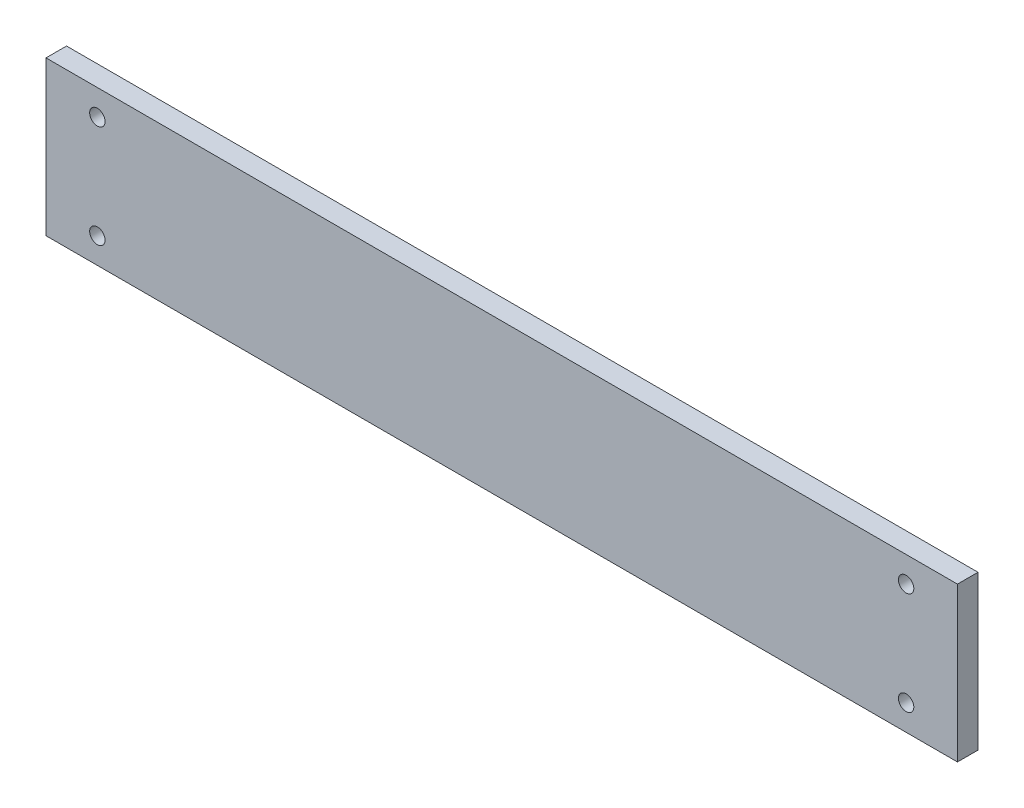
ISO-10303-21;
HEADER;
FILE_DESCRIPTION(('STEP AP214'),'2;1');
FILE_NAME('part.step','',(''),(''),'','','');
FILE_SCHEMA(('AUTOMOTIVE_DESIGN { 1 0 10303 214 1 1 1 1 }'));
ENDSEC;
DATA;
#1=APPLICATION_CONTEXT('core data for automotive mechanical design processes');
#2=APPLICATION_PROTOCOL_DEFINITION('international standard','automotive_design',2000,#1);
#3=PRODUCT_CONTEXT('',#1,'mechanical');
#4=PRODUCT('Part','Part','',(#3));
#5=PRODUCT_RELATED_PRODUCT_CATEGORY('part','',(#4));
#6=PRODUCT_DEFINITION_FORMATION('','',#4);
#7=PRODUCT_DEFINITION_CONTEXT('part definition',#1,'design');
#8=PRODUCT_DEFINITION('design','',#6,#7);
#9=PRODUCT_DEFINITION_SHAPE('','',#8);
#10=(LENGTH_UNIT() NAMED_UNIT(*) SI_UNIT(.MILLI.,.METRE.));
#11=(NAMED_UNIT(*) PLANE_ANGLE_UNIT() SI_UNIT($,.RADIAN.));
#12=(NAMED_UNIT(*) SI_UNIT($,.STERADIAN.) SOLID_ANGLE_UNIT());
#13=UNCERTAINTY_MEASURE_WITH_UNIT(LENGTH_MEASURE(1.E-05),#10,'distance_accuracy_value','');
#14=(GEOMETRIC_REPRESENTATION_CONTEXT(3) GLOBAL_UNCERTAINTY_ASSIGNED_CONTEXT((#13)) GLOBAL_UNIT_ASSIGNED_CONTEXT((#10,
#11,#12)) REPRESENTATION_CONTEXT('',''));
#15=CARTESIAN_POINT('',(0.,0.,0.));
#16=DIRECTION('',(0.,0.,1.));
#17=DIRECTION('',(1.,0.,0.));
#18=AXIS2_PLACEMENT_3D('',#15,#16,#17);
#19=CARTESIAN_POINT('',(0.,0.,4.));
#20=DIRECTION('',(0.,0.,-1.));
#21=DIRECTION('',(-1.,0.,0.));
#22=AXIS2_PLACEMENT_3D('',#19,#20,#21);
#23=PLANE('',#22);
#24=DIRECTION('',(0.,-1.,0.));
#25=VECTOR('',#24,1.);
#26=CARTESIAN_POINT('',(-106.323961564175,12.1976533010574,4.));
#27=LINE('',#26,#25);
#28=CARTESIAN_POINT('',(-106.323961564175,42.1976533010574,4.));
#29=VERTEX_POINT('',#28);
#30=CARTESIAN_POINT('',(-106.323961564175,12.1976533010574,4.));
#31=VERTEX_POINT('',#30);
#32=EDGE_CURVE('E102',#29,#31,#27,.T.);
#33=ORIENTED_EDGE('',*,*,#32,.T.);
#34=DIRECTION('',(1.,0.,0.));
#35=VECTOR('',#34,1.);
#36=CARTESIAN_POINT('',(71.1760384358255,12.1976533010574,4.));
#37=LINE('',#36,#35);
#38=CARTESIAN_POINT('',(71.1760384358255,12.1976533010574,4.));
#39=VERTEX_POINT('',#38);
#40=EDGE_CURVE('E97',#31,#39,#37,.T.);
#41=ORIENTED_EDGE('',*,*,#40,.T.);
#42=DIRECTION('',(0.,1.,0.));
#43=VECTOR('',#42,1.);
#44=CARTESIAN_POINT('',(71.1760384358255,42.1976533010574,4.));
#45=LINE('',#44,#43);
#46=CARTESIAN_POINT('',(71.1760384358255,42.1976533010574,4.));
#47=VERTEX_POINT('',#46);
#48=EDGE_CURVE('E100',#39,#47,#45,.T.);
#49=ORIENTED_EDGE('',*,*,#48,.T.);
#50=DIRECTION('',(-1.,0.,0.));
#51=VECTOR('',#50,1.);
#52=CARTESIAN_POINT('',(-106.323961564175,42.1976533010574,4.));
#53=LINE('',#52,#51);
#54=EDGE_CURVE('E67',#47,#29,#53,.T.);
#55=ORIENTED_EDGE('',*,*,#54,.T.);
#56=EDGE_LOOP('',(#33,#41,#49,#55));
#57=FACE_BOUND('',#56,.T.);
#58=CARTESIAN_POINT('',(-96.3239615641745,37.1976533010574,4.));
#59=DIRECTION('',(0.,0.,1.));
#60=DIRECTION('',(1.,0.,0.));
#61=AXIS2_PLACEMENT_3D('',#58,#59,#60);
#62=CIRCLE('',#61,1.5);
#63=CARTESIAN_POINT('',(-94.8239615641745,37.1976533010574,4.));
#64=VERTEX_POINT('',#63);
#65=EDGE_CURVE('E122',#64,#64,#62,.T.);
#66=ORIENTED_EDGE('',*,*,#65,.F.);
#67=EDGE_LOOP('',(#66));
#68=FACE_BOUND('',#67,.T.);
#69=CARTESIAN_POINT('',(-96.3239615641745,17.1976533010574,4.));
#70=DIRECTION('',(0.,0.,1.));
#71=DIRECTION('',(1.,0.,0.));
#72=AXIS2_PLACEMENT_3D('',#69,#70,#71);
#73=CIRCLE('',#72,1.5);
#74=CARTESIAN_POINT('',(-94.8239615641745,17.1976533010574,4.));
#75=VERTEX_POINT('',#74);
#76=EDGE_CURVE('E144',#75,#75,#73,.T.);
#77=ORIENTED_EDGE('',*,*,#76,.F.);
#78=EDGE_LOOP('',(#77));
#79=FACE_BOUND('',#78,.T.);
#80=CARTESIAN_POINT('',(61.1760384358255,37.1976533010575,4.));
#81=DIRECTION('',(0.,0.,1.));
#82=DIRECTION('',(1.,0.,0.));
#83=AXIS2_PLACEMENT_3D('',#80,#81,#82);
#84=CIRCLE('',#83,1.49999999999999);
#85=CARTESIAN_POINT('',(62.6760384358254,37.1976533010575,4.));
#86=VERTEX_POINT('',#85);
#87=EDGE_CURVE('E152',#86,#86,#84,.T.);
#88=ORIENTED_EDGE('',*,*,#87,.F.);
#89=EDGE_LOOP('',(#88));
#90=FACE_BOUND('',#89,.T.);
#91=CARTESIAN_POINT('',(61.1760384358255,17.1976533010574,4.));
#92=DIRECTION('',(0.,0.,1.));
#93=DIRECTION('',(1.,0.,0.));
#94=AXIS2_PLACEMENT_3D('',#91,#92,#93);
#95=CIRCLE('',#94,1.49999999999999);
#96=CARTESIAN_POINT('',(62.6760384358254,17.1976533010574,4.));
#97=VERTEX_POINT('',#96);
#98=EDGE_CURVE('E160',#97,#97,#95,.T.);
#99=ORIENTED_EDGE('',*,*,#98,.F.);
#100=EDGE_LOOP('',(#99));
#101=FACE_BOUND('',#100,.T.);
#102=ADVANCED_FACE('F49',(#57,#68,#79,#90,#101),#23,.F.);
#103=CARTESIAN_POINT('',(0.,0.,0.));
#104=DIRECTION('',(0.,0.,-1.));
#105=DIRECTION('',(-1.,0.,0.));
#106=AXIS2_PLACEMENT_3D('',#103,#104,#105);
#107=PLANE('',#106);
#108=CARTESIAN_POINT('',(61.1760384358255,37.1976533010575,0.));
#109=DIRECTION('',(0.,0.,1.));
#110=DIRECTION('',(1.,0.,0.));
#111=AXIS2_PLACEMENT_3D('',#108,#109,#110);
#112=CIRCLE('',#111,1.49999999999999);
#113=CARTESIAN_POINT('',(62.6760384358254,37.1976533010575,0.));
#114=VERTEX_POINT('',#113);
#115=EDGE_CURVE('E156',#114,#114,#112,.T.);
#116=ORIENTED_EDGE('',*,*,#115,.T.);
#117=EDGE_LOOP('',(#116));
#118=FACE_BOUND('',#117,.T.);
#119=CARTESIAN_POINT('',(-96.3239615641745,37.1976533010574,0.));
#120=DIRECTION('',(0.,0.,1.));
#121=DIRECTION('',(1.,0.,0.));
#122=AXIS2_PLACEMENT_3D('',#119,#120,#121);
#123=CIRCLE('',#122,1.5);
#124=CARTESIAN_POINT('',(-94.8239615641745,37.1976533010574,0.));
#125=VERTEX_POINT('',#124);
#126=EDGE_CURVE('E140',#125,#125,#123,.T.);
#127=ORIENTED_EDGE('',*,*,#126,.T.);
#128=EDGE_LOOP('',(#127));
#129=FACE_BOUND('',#128,.T.);
#130=DIRECTION('',(0.,-1.,0.));
#131=VECTOR('',#130,1.);
#132=CARTESIAN_POINT('',(-106.323961564175,12.1976533010574,0.));
#133=LINE('',#132,#131);
#134=CARTESIAN_POINT('',(-106.323961564175,42.1976533010574,0.));
#135=VERTEX_POINT('',#134);
#136=CARTESIAN_POINT('',(-106.323961564175,12.1976533010574,0.));
#137=VERTEX_POINT('',#136);
#138=EDGE_CURVE('E118',#135,#137,#133,.T.);
#139=ORIENTED_EDGE('',*,*,#138,.F.);
#140=DIRECTION('',(-1.,0.,0.));
#141=VECTOR('',#140,1.);
#142=CARTESIAN_POINT('',(-106.323961564175,42.1976533010574,0.));
#143=LINE('',#142,#141);
#144=CARTESIAN_POINT('',(71.1760384358255,42.1976533010574,0.));
#145=VERTEX_POINT('',#144);
#146=EDGE_CURVE('E90',#145,#135,#143,.T.);
#147=ORIENTED_EDGE('',*,*,#146,.F.);
#148=DIRECTION('',(0.,1.,0.));
#149=VECTOR('',#148,1.);
#150=CARTESIAN_POINT('',(71.1760384358255,42.1976533010574,0.));
#151=LINE('',#150,#149);
#152=CARTESIAN_POINT('',(71.1760384358255,12.1976533010574,0.));
#153=VERTEX_POINT('',#152);
#154=EDGE_CURVE('E84',#153,#145,#151,.T.);
#155=ORIENTED_EDGE('',*,*,#154,.F.);
#156=DIRECTION('',(1.,0.,0.));
#157=VECTOR('',#156,1.);
#158=CARTESIAN_POINT('',(71.1760384358255,12.1976533010574,0.));
#159=LINE('',#158,#157);
#160=EDGE_CURVE('E107',#137,#153,#159,.T.);
#161=ORIENTED_EDGE('',*,*,#160,.F.);
#162=EDGE_LOOP('',(#139,#147,#155,#161));
#163=FACE_BOUND('',#162,.T.);
#164=CARTESIAN_POINT('',(-96.3239615641745,17.1976533010574,0.));
#165=DIRECTION('',(0.,0.,1.));
#166=DIRECTION('',(1.,0.,0.));
#167=AXIS2_PLACEMENT_3D('',#164,#165,#166);
#168=CIRCLE('',#167,1.5);
#169=CARTESIAN_POINT('',(-94.8239615641745,17.1976533010574,0.));
#170=VERTEX_POINT('',#169);
#171=EDGE_CURVE('E148',#170,#170,#168,.T.);
#172=ORIENTED_EDGE('',*,*,#171,.T.);
#173=EDGE_LOOP('',(#172));
#174=FACE_BOUND('',#173,.T.);
#175=CARTESIAN_POINT('',(61.1760384358255,17.1976533010574,0.));
#176=DIRECTION('',(0.,0.,1.));
#177=DIRECTION('',(1.,0.,0.));
#178=AXIS2_PLACEMENT_3D('',#175,#176,#177);
#179=CIRCLE('',#178,1.49999999999999);
#180=CARTESIAN_POINT('',(62.6760384358254,17.1976533010574,0.));
#181=VERTEX_POINT('',#180);
#182=EDGE_CURVE('E164',#181,#181,#179,.T.);
#183=ORIENTED_EDGE('',*,*,#182,.T.);
#184=EDGE_LOOP('',(#183));
#185=FACE_BOUND('',#184,.T.);
#186=ADVANCED_FACE('F135',(#118,#129,#163,#174,#185),#107,.T.);
#187=CARTESIAN_POINT('',(-106.323961564175,12.1976533010574,4.));
#188=DIRECTION('',(1.,0.,0.));
#189=DIRECTION('',(0.,0.,-1.));
#190=AXIS2_PLACEMENT_3D('',#187,#188,#189);
#191=PLANE('',#190);
#192=ORIENTED_EDGE('',*,*,#138,.T.);
#193=DIRECTION('',(0.,0.,-1.));
#194=VECTOR('',#193,1.);
#195=CARTESIAN_POINT('',(-106.323961564175,12.1976533010574,4.));
#196=LINE('',#195,#194);
#197=EDGE_CURVE('E11',#31,#137,#196,.T.);
#198=ORIENTED_EDGE('',*,*,#197,.F.);
#199=ORIENTED_EDGE('',*,*,#32,.F.);
#200=DIRECTION('',(0.,0.,-1.));
#201=VECTOR('',#200,1.);
#202=CARTESIAN_POINT('',(-106.323961564175,42.1976533010574,4.));
#203=LINE('',#202,#201);
#204=EDGE_CURVE('E114',#29,#135,#203,.T.);
#205=ORIENTED_EDGE('',*,*,#204,.T.);
#206=EDGE_LOOP('',(#192,#198,#199,#205));
#207=FACE_BOUND('',#206,.T.);
#208=ADVANCED_FACE('F51',(#207),#191,.F.);
#209=CARTESIAN_POINT('',(71.1760384358255,12.1976533010574,4.));
#210=DIRECTION('',(0.,1.,0.));
#211=DIRECTION('',(-1.,0.,0.));
#212=AXIS2_PLACEMENT_3D('',#209,#210,#211);
#213=PLANE('',#212);
#214=ORIENTED_EDGE('',*,*,#160,.T.);
#215=DIRECTION('',(0.,0.,-1.));
#216=VECTOR('',#215,1.);
#217=CARTESIAN_POINT('',(71.1760384358255,12.1976533010574,4.));
#218=LINE('',#217,#216);
#219=EDGE_CURVE('E59',#39,#153,#218,.T.);
#220=ORIENTED_EDGE('',*,*,#219,.F.);
#221=ORIENTED_EDGE('',*,*,#40,.F.);
#222=ORIENTED_EDGE('',*,*,#197,.T.);
#223=EDGE_LOOP('',(#214,#220,#221,#222));
#224=FACE_BOUND('',#223,.T.);
#225=ADVANCED_FACE('F106',(#224),#213,.F.);
#226=CARTESIAN_POINT('',(71.1760384358255,42.1976533010574,4.));
#227=DIRECTION('',(-1.,0.,0.));
#228=DIRECTION('',(0.,0.,1.));
#229=AXIS2_PLACEMENT_3D('',#226,#227,#228);
#230=PLANE('',#229);
#231=ORIENTED_EDGE('',*,*,#154,.T.);
#232=DIRECTION('',(0.,0.,-1.));
#233=VECTOR('',#232,1.);
#234=CARTESIAN_POINT('',(71.1760384358255,42.1976533010574,4.));
#235=LINE('',#234,#233);
#236=EDGE_CURVE('E109',#47,#145,#235,.T.);
#237=ORIENTED_EDGE('',*,*,#236,.F.);
#238=ORIENTED_EDGE('',*,*,#48,.F.);
#239=ORIENTED_EDGE('',*,*,#219,.T.);
#240=EDGE_LOOP('',(#231,#237,#238,#239));
#241=FACE_BOUND('',#240,.T.);
#242=ADVANCED_FACE('F110',(#241),#230,.F.);
#243=CARTESIAN_POINT('',(-106.323961564175,42.1976533010574,4.));
#244=DIRECTION('',(0.,-1.,0.));
#245=DIRECTION('',(1.,0.,0.));
#246=AXIS2_PLACEMENT_3D('',#243,#244,#245);
#247=PLANE('',#246);
#248=ORIENTED_EDGE('',*,*,#146,.T.);
#249=ORIENTED_EDGE('',*,*,#204,.F.);
#250=ORIENTED_EDGE('',*,*,#54,.F.);
#251=ORIENTED_EDGE('',*,*,#236,.T.);
#252=EDGE_LOOP('',(#248,#249,#250,#251));
#253=FACE_BOUND('',#252,.T.);
#254=ADVANCED_FACE('F132',(#253),#247,.F.);
#255=CARTESIAN_POINT('',(-96.3239615641745,37.1976533010574,4.));
#256=DIRECTION('',(0.,0.,-1.));
#257=DIRECTION('',(-1.,0.,0.));
#258=AXIS2_PLACEMENT_3D('',#255,#256,#257);
#259=CYLINDRICAL_SURFACE('',#258,1.5);
#260=ORIENTED_EDGE('',*,*,#65,.T.);
#261=EDGE_LOOP('',(#260));
#262=FACE_BOUND('',#261,.T.);
#263=ORIENTED_EDGE('',*,*,#126,.F.);
#264=EDGE_LOOP('',(#263));
#265=FACE_BOUND('',#264,.T.);
#266=ADVANCED_FACE('F183',(#262,#265),#259,.F.);
#267=CARTESIAN_POINT('',(-96.3239615641745,17.1976533010574,4.));
#268=DIRECTION('',(0.,0.,-1.));
#269=DIRECTION('',(-1.,0.,0.));
#270=AXIS2_PLACEMENT_3D('',#267,#268,#269);
#271=CYLINDRICAL_SURFACE('',#270,1.5);
#272=ORIENTED_EDGE('',*,*,#76,.T.);
#273=EDGE_LOOP('',(#272));
#274=FACE_BOUND('',#273,.T.);
#275=ORIENTED_EDGE('',*,*,#171,.F.);
#276=EDGE_LOOP('',(#275));
#277=FACE_BOUND('',#276,.T.);
#278=ADVANCED_FACE('F251',(#274,#277),#271,.F.);
#279=CARTESIAN_POINT('',(61.1760384358255,37.1976533010575,4.));
#280=DIRECTION('',(0.,0.,-1.));
#281=DIRECTION('',(-1.,0.,0.));
#282=AXIS2_PLACEMENT_3D('',#279,#280,#281);
#283=CYLINDRICAL_SURFACE('',#282,1.49999999999999);
#284=ORIENTED_EDGE('',*,*,#87,.T.);
#285=EDGE_LOOP('',(#284));
#286=FACE_BOUND('',#285,.T.);
#287=ORIENTED_EDGE('',*,*,#115,.F.);
#288=EDGE_LOOP('',(#287));
#289=FACE_BOUND('',#288,.T.);
#290=ADVANCED_FACE('F262',(#286,#289),#283,.F.);
#291=CARTESIAN_POINT('',(61.1760384358255,17.1976533010574,4.));
#292=DIRECTION('',(0.,0.,-1.));
#293=DIRECTION('',(-1.,0.,0.));
#294=AXIS2_PLACEMENT_3D('',#291,#292,#293);
#295=CYLINDRICAL_SURFACE('',#294,1.49999999999999);
#296=ORIENTED_EDGE('',*,*,#98,.T.);
#297=EDGE_LOOP('',(#296));
#298=FACE_BOUND('',#297,.T.);
#299=ORIENTED_EDGE('',*,*,#182,.F.);
#300=EDGE_LOOP('',(#299));
#301=FACE_BOUND('',#300,.T.);
#302=ADVANCED_FACE('F172',(#298,#301),#295,.F.);
#303=CLOSED_SHELL('',(#102,#186,#208,#225,#242,#254,#266,#278,#290,#302));
#304=MANIFOLD_SOLID_BREP('B2',#303);
#305=ADVANCED_BREP_SHAPE_REPRESENTATION('',(#18,#304),#14);
#306=SHAPE_DEFINITION_REPRESENTATION(#9,#305);
ENDSEC;
END-ISO-10303-21;
